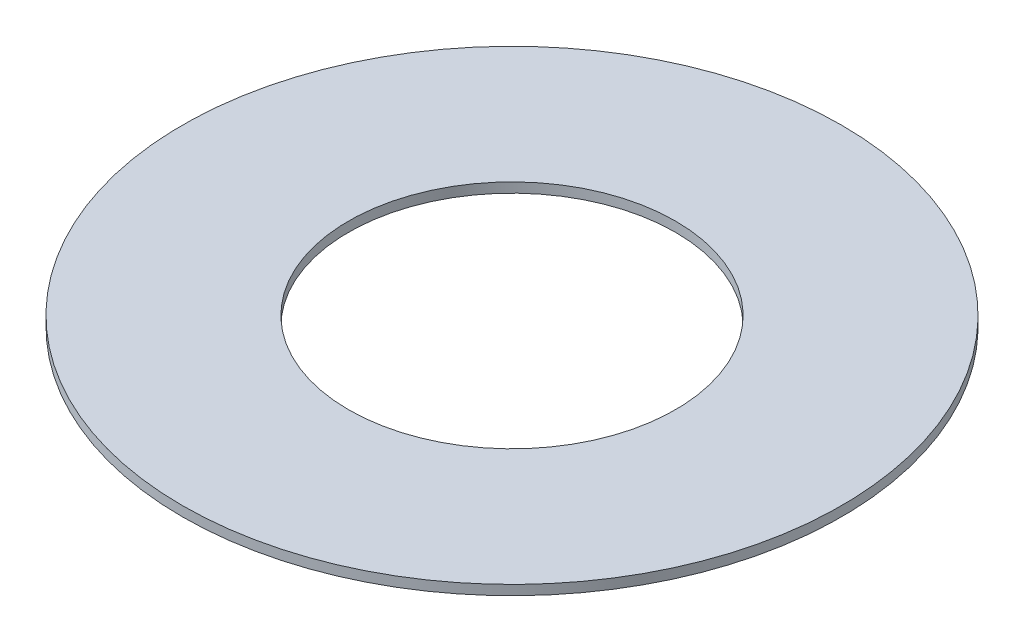
ISO-10303-21;
HEADER;
FILE_DESCRIPTION(('STEP AP214'),'2;1');
FILE_NAME('part.step','',(''),(''),'','','');
FILE_SCHEMA(('AUTOMOTIVE_DESIGN { 1 0 10303 214 1 1 1 1 }'));
ENDSEC;
DATA;
#1=APPLICATION_CONTEXT('core data for automotive mechanical design processes');
#2=APPLICATION_PROTOCOL_DEFINITION('international standard','automotive_design',2000,#1);
#3=PRODUCT_CONTEXT('',#1,'mechanical');
#4=PRODUCT('Part','Part','',(#3));
#5=PRODUCT_RELATED_PRODUCT_CATEGORY('part','',(#4));
#6=PRODUCT_DEFINITION_FORMATION('','',#4);
#7=PRODUCT_DEFINITION_CONTEXT('part definition',#1,'design');
#8=PRODUCT_DEFINITION('design','',#6,#7);
#9=PRODUCT_DEFINITION_SHAPE('','',#8);
#10=(LENGTH_UNIT() NAMED_UNIT(*) SI_UNIT(.MILLI.,.METRE.));
#11=(NAMED_UNIT(*) PLANE_ANGLE_UNIT() SI_UNIT($,.RADIAN.));
#12=(NAMED_UNIT(*) SI_UNIT($,.STERADIAN.) SOLID_ANGLE_UNIT());
#13=UNCERTAINTY_MEASURE_WITH_UNIT(LENGTH_MEASURE(1.E-05),#10,'distance_accuracy_value','');
#14=(GEOMETRIC_REPRESENTATION_CONTEXT(3) GLOBAL_UNCERTAINTY_ASSIGNED_CONTEXT((#13)) GLOBAL_UNIT_ASSIGNED_CONTEXT((#10,
#11,#12)) REPRESENTATION_CONTEXT('',''));
#15=CARTESIAN_POINT('',(0.,0.,0.));
#16=DIRECTION('',(0.,0.,1.));
#17=DIRECTION('',(1.,0.,0.));
#18=AXIS2_PLACEMENT_3D('',#15,#16,#17);
#19=CARTESIAN_POINT('',(0.,2.,0.));
#20=DIRECTION('',(0.,1.,0.));
#21=DIRECTION('',(0.,0.,1.));
#22=AXIS2_PLACEMENT_3D('',#19,#20,#21);
#23=PLANE('',#22);
#24=CARTESIAN_POINT('',(0.,2.,0.));
#25=DIRECTION('',(0.,1.,0.));
#26=DIRECTION('',(0.,0.,1.));
#27=AXIS2_PLACEMENT_3D('',#24,#25,#26);
#28=CIRCLE('',#27,67.48);
#29=CARTESIAN_POINT('',(0.,2.,67.48));
#30=VERTEX_POINT('',#29);
#31=EDGE_CURVE('E10',#30,#30,#28,.T.);
#32=ORIENTED_EDGE('',*,*,#31,.T.);
#33=EDGE_LOOP('',(#32));
#34=FACE_BOUND('',#33,.T.);
#35=CARTESIAN_POINT('',(0.,2.,0.));
#36=DIRECTION('',(0.,1.,0.));
#37=DIRECTION('',(0.,0.,1.));
#38=AXIS2_PLACEMENT_3D('',#35,#36,#37);
#39=CIRCLE('',#38,33.47);
#40=CARTESIAN_POINT('',(0.,2.,33.47));
#41=VERTEX_POINT('',#40);
#42=EDGE_CURVE('E52',#41,#41,#39,.T.);
#43=ORIENTED_EDGE('',*,*,#42,.F.);
#44=EDGE_LOOP('',(#43));
#45=FACE_BOUND('',#44,.T.);
#46=ADVANCED_FACE('F39',(#34,#45),#23,.T.);
#47=CARTESIAN_POINT('',(0.,0.,0.));
#48=DIRECTION('',(0.,1.,0.));
#49=DIRECTION('',(0.,0.,1.));
#50=AXIS2_PLACEMENT_3D('',#47,#48,#49);
#51=PLANE('',#50);
#52=CARTESIAN_POINT('',(0.,0.,0.));
#53=DIRECTION('',(0.,1.,0.));
#54=DIRECTION('',(0.,0.,1.));
#55=AXIS2_PLACEMENT_3D('',#52,#53,#54);
#56=CIRCLE('',#55,67.48);
#57=CARTESIAN_POINT('',(0.,0.,67.48));
#58=VERTEX_POINT('',#57);
#59=EDGE_CURVE('E43',#58,#58,#56,.T.);
#60=ORIENTED_EDGE('',*,*,#59,.F.);
#61=EDGE_LOOP('',(#60));
#62=FACE_BOUND('',#61,.T.);
#63=CARTESIAN_POINT('',(0.,0.,0.));
#64=DIRECTION('',(0.,1.,0.));
#65=DIRECTION('',(0.,0.,1.));
#66=AXIS2_PLACEMENT_3D('',#63,#64,#65);
#67=CIRCLE('',#66,33.47);
#68=CARTESIAN_POINT('',(0.,0.,33.47));
#69=VERTEX_POINT('',#68);
#70=EDGE_CURVE('E54',#69,#69,#67,.T.);
#71=ORIENTED_EDGE('',*,*,#70,.T.);
#72=EDGE_LOOP('',(#71));
#73=FACE_BOUND('',#72,.T.);
#74=ADVANCED_FACE('F66',(#62,#73),#51,.F.);
#75=CARTESIAN_POINT('',(0.,2.,0.));
#76=DIRECTION('',(0.,-1.,0.));
#77=DIRECTION('',(0.,0.,-1.));
#78=AXIS2_PLACEMENT_3D('',#75,#76,#77);
#79=CYLINDRICAL_SURFACE('',#78,67.48);
#80=ORIENTED_EDGE('',*,*,#31,.F.);
#81=EDGE_LOOP('',(#80));
#82=FACE_BOUND('',#81,.T.);
#83=ORIENTED_EDGE('',*,*,#59,.T.);
#84=EDGE_LOOP('',(#83));
#85=FACE_BOUND('',#84,.T.);
#86=ADVANCED_FACE('F41',(#82,#85),#79,.T.);
#87=CARTESIAN_POINT('',(0.,2.,0.));
#88=DIRECTION('',(0.,-1.,0.));
#89=DIRECTION('',(0.,0.,-1.));
#90=AXIS2_PLACEMENT_3D('',#87,#88,#89);
#91=CYLINDRICAL_SURFACE('',#90,33.47);
#92=ORIENTED_EDGE('',*,*,#42,.T.);
#93=EDGE_LOOP('',(#92));
#94=FACE_BOUND('',#93,.T.);
#95=ORIENTED_EDGE('',*,*,#70,.F.);
#96=EDGE_LOOP('',(#95));
#97=FACE_BOUND('',#96,.T.);
#98=ADVANCED_FACE('F62',(#94,#97),#91,.F.);
#99=CLOSED_SHELL('',(#46,#74,#86,#98));
#100=MANIFOLD_SOLID_BREP('B2',#99);
#101=ADVANCED_BREP_SHAPE_REPRESENTATION('',(#18,#100),#14);
#102=SHAPE_DEFINITION_REPRESENTATION(#9,#101);
ENDSEC;
END-ISO-10303-21;
